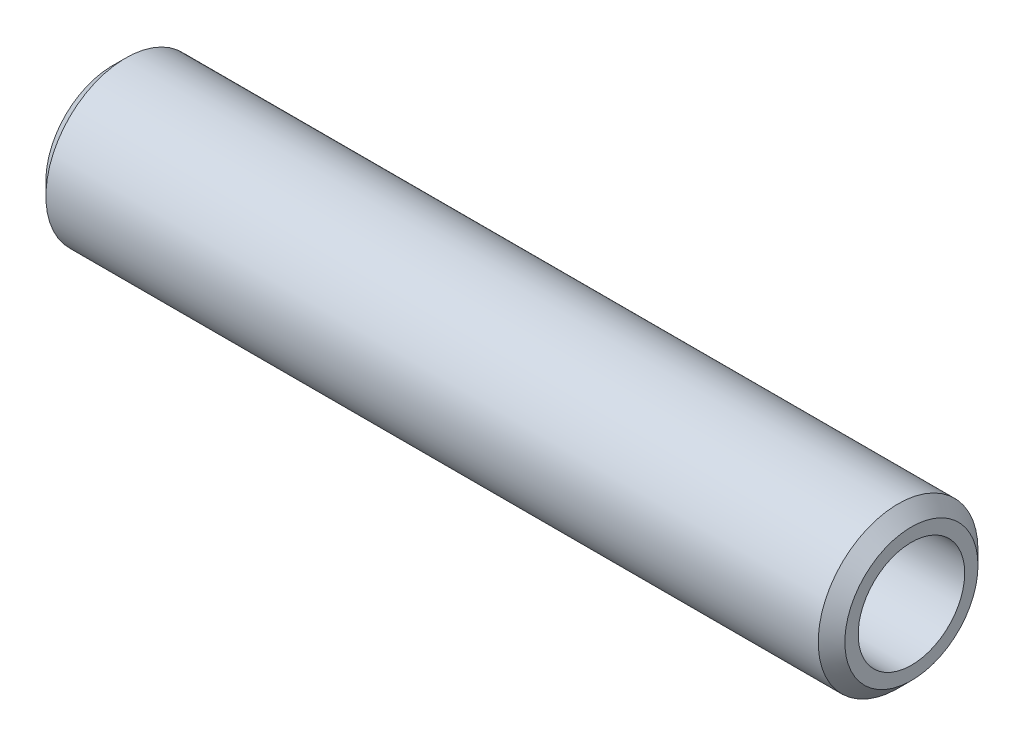
ISO-10303-21;
HEADER;
FILE_DESCRIPTION(('STEP AP214'),'2;1');
FILE_NAME('part.step','',(''),(''),'','','');
FILE_SCHEMA(('AUTOMOTIVE_DESIGN { 1 0 10303 214 1 1 1 1 }'));
ENDSEC;
DATA;
#1=APPLICATION_CONTEXT('core data for automotive mechanical design processes');
#2=APPLICATION_PROTOCOL_DEFINITION('international standard','automotive_design',2000,#1);
#3=PRODUCT_CONTEXT('',#1,'mechanical');
#4=PRODUCT('Part','Part','',(#3));
#5=PRODUCT_RELATED_PRODUCT_CATEGORY('part','',(#4));
#6=PRODUCT_DEFINITION_FORMATION('','',#4);
#7=PRODUCT_DEFINITION_CONTEXT('part definition',#1,'design');
#8=PRODUCT_DEFINITION('design','',#6,#7);
#9=PRODUCT_DEFINITION_SHAPE('','',#8);
#10=(LENGTH_UNIT() NAMED_UNIT(*) SI_UNIT(.MILLI.,.METRE.));
#11=(NAMED_UNIT(*) PLANE_ANGLE_UNIT() SI_UNIT($,.RADIAN.));
#12=(NAMED_UNIT(*) SI_UNIT($,.STERADIAN.) SOLID_ANGLE_UNIT());
#13=UNCERTAINTY_MEASURE_WITH_UNIT(LENGTH_MEASURE(1.E-05),#10,'distance_accuracy_value','');
#14=(GEOMETRIC_REPRESENTATION_CONTEXT(3) GLOBAL_UNCERTAINTY_ASSIGNED_CONTEXT((#13)) GLOBAL_UNIT_ASSIGNED_CONTEXT((#10,
#11,#12)) REPRESENTATION_CONTEXT('',''));
#15=CARTESIAN_POINT('',(0.,0.,0.));
#16=DIRECTION('',(0.,0.,1.));
#17=DIRECTION('',(1.,0.,0.));
#18=AXIS2_PLACEMENT_3D('',#15,#16,#17);
#19=CARTESIAN_POINT('',(15.,0.,0.));
#20=DIRECTION('',(1.,0.,0.));
#21=DIRECTION('',(0.,0.,-1.));
#22=AXIS2_PLACEMENT_3D('',#19,#20,#21);
#23=PLANE('',#22);
#24=CARTESIAN_POINT('',(15.,0.,0.));
#25=DIRECTION('',(1.,0.,0.));
#26=DIRECTION('',(0.,0.,-1.));
#27=AXIS2_PLACEMENT_3D('',#24,#25,#26);
#28=CIRCLE('',#27,2.5);
#29=CARTESIAN_POINT('',(15.,0.,-2.5));
#30=VERTEX_POINT('',#29);
#31=EDGE_CURVE('E10',#30,#30,#28,.T.);
#32=ORIENTED_EDGE('',*,*,#31,.T.);
#33=EDGE_LOOP('',(#32));
#34=FACE_BOUND('',#33,.T.);
#35=CARTESIAN_POINT('',(15.,0.,0.));
#36=DIRECTION('',(1.,0.,0.));
#37=DIRECTION('',(0.,0.,-1.));
#38=AXIS2_PLACEMENT_3D('',#35,#36,#37);
#39=CIRCLE('',#38,2.);
#40=CARTESIAN_POINT('',(15.,0.,-2.));
#41=VERTEX_POINT('',#40);
#42=EDGE_CURVE('E60',#41,#41,#39,.T.);
#43=ORIENTED_EDGE('',*,*,#42,.F.);
#44=EDGE_LOOP('',(#43));
#45=FACE_BOUND('',#44,.T.);
#46=ADVANCED_FACE('F39',(#34,#45),#23,.T.);
#47=CARTESIAN_POINT('',(-15.,0.,0.));
#48=DIRECTION('',(1.,0.,0.));
#49=DIRECTION('',(0.,0.,-1.));
#50=AXIS2_PLACEMENT_3D('',#47,#48,#49);
#51=PLANE('',#50);
#52=CARTESIAN_POINT('',(-15.,0.,0.));
#53=DIRECTION('',(1.,0.,0.));
#54=DIRECTION('',(0.,0.,-1.));
#55=AXIS2_PLACEMENT_3D('',#52,#53,#54);
#56=CIRCLE('',#55,2.5);
#57=CARTESIAN_POINT('',(-15.,0.,-2.5));
#58=VERTEX_POINT('',#57);
#59=EDGE_CURVE('E47',#58,#58,#56,.F.);
#60=ORIENTED_EDGE('',*,*,#59,.T.);
#61=EDGE_LOOP('',(#60));
#62=FACE_BOUND('',#61,.T.);
#63=CARTESIAN_POINT('',(-15.,0.,0.));
#64=DIRECTION('',(1.,0.,0.));
#65=DIRECTION('',(0.,0.,-1.));
#66=AXIS2_PLACEMENT_3D('',#63,#64,#65);
#67=CIRCLE('',#66,2.);
#68=CARTESIAN_POINT('',(-15.,0.,-2.));
#69=VERTEX_POINT('',#68);
#70=EDGE_CURVE('E61',#69,#69,#67,.T.);
#71=ORIENTED_EDGE('',*,*,#70,.T.);
#72=EDGE_LOOP('',(#71));
#73=FACE_BOUND('',#72,.T.);
#74=ADVANCED_FACE('F71',(#62,#73),#51,.F.);
#75=CARTESIAN_POINT('',(15.,0.,0.));
#76=DIRECTION('',(-1.,0.,0.));
#77=DIRECTION('',(0.,0.,1.));
#78=AXIS2_PLACEMENT_3D('',#75,#76,#77);
#79=CYLINDRICAL_SURFACE('',#78,3.);
#80=CARTESIAN_POINT('',(-14.5,0.,0.));
#81=DIRECTION('',(1.,0.,0.));
#82=DIRECTION('',(0.,0.,-1.));
#83=AXIS2_PLACEMENT_3D('',#80,#81,#82);
#84=CIRCLE('',#83,3.);
#85=CARTESIAN_POINT('',(-14.5,0.,-3.));
#86=VERTEX_POINT('',#85);
#87=EDGE_CURVE('E51',#86,#86,#84,.T.);
#88=ORIENTED_EDGE('',*,*,#87,.T.);
#89=EDGE_LOOP('',(#88));
#90=FACE_BOUND('',#89,.T.);
#91=CARTESIAN_POINT('',(14.5,0.,0.));
#92=DIRECTION('',(1.,0.,0.));
#93=DIRECTION('',(0.,0.,-1.));
#94=AXIS2_PLACEMENT_3D('',#91,#92,#93);
#95=CIRCLE('',#94,3.);
#96=CARTESIAN_POINT('',(14.5,0.,-3.));
#97=VERTEX_POINT('',#96);
#98=EDGE_CURVE('E55',#97,#97,#95,.F.);
#99=ORIENTED_EDGE('',*,*,#98,.T.);
#100=EDGE_LOOP('',(#99));
#101=FACE_BOUND('',#100,.T.);
#102=ADVANCED_FACE('F76',(#90,#101),#79,.T.);
#103=CARTESIAN_POINT('',(15.,0.,0.));
#104=DIRECTION('',(-1.,0.,0.));
#105=DIRECTION('',(0.,0.,1.));
#106=AXIS2_PLACEMENT_3D('',#103,#104,#105);
#107=CYLINDRICAL_SURFACE('',#106,2.);
#108=ORIENTED_EDGE('',*,*,#42,.T.);
#109=EDGE_LOOP('',(#108));
#110=FACE_BOUND('',#109,.T.);
#111=ORIENTED_EDGE('',*,*,#70,.F.);
#112=EDGE_LOOP('',(#111));
#113=FACE_BOUND('',#112,.T.);
#114=ADVANCED_FACE('F67',(#110,#113),#107,.F.);
#115=CARTESIAN_POINT('',(-14.5,0.,0.));
#116=DIRECTION('',(1.,0.,0.));
#117=DIRECTION('',(0.,0.,-1.));
#118=AXIS2_PLACEMENT_3D('',#115,#116,#117);
#119=CONICAL_SURFACE('',#118,3.,0.785398163397449);
#120=ORIENTED_EDGE('',*,*,#59,.F.);
#121=EDGE_LOOP('',(#120));
#122=FACE_BOUND('',#121,.T.);
#123=ORIENTED_EDGE('',*,*,#87,.F.);
#124=EDGE_LOOP('',(#123));
#125=FACE_BOUND('',#124,.T.);
#126=ADVANCED_FACE('F83',(#122,#125),#119,.T.);
#127=CARTESIAN_POINT('',(15.,0.,0.));
#128=DIRECTION('',(-1.,0.,0.));
#129=DIRECTION('',(0.,0.,1.));
#130=AXIS2_PLACEMENT_3D('',#127,#128,#129);
#131=CONICAL_SURFACE('',#130,2.5,0.785398163397445);
#132=ORIENTED_EDGE('',*,*,#98,.F.);
#133=EDGE_LOOP('',(#132));
#134=FACE_BOUND('',#133,.T.);
#135=ORIENTED_EDGE('',*,*,#31,.F.);
#136=EDGE_LOOP('',(#135));
#137=FACE_BOUND('',#136,.T.);
#138=ADVANCED_FACE('F42',(#134,#137),#131,.T.);
#139=CLOSED_SHELL('',(#46,#74,#102,#114,#126,#138));
#140=MANIFOLD_SOLID_BREP('B2',#139);
#141=ADVANCED_BREP_SHAPE_REPRESENTATION('',(#18,#140),#14);
#142=SHAPE_DEFINITION_REPRESENTATION(#9,#141);
ENDSEC;
END-ISO-10303-21;
